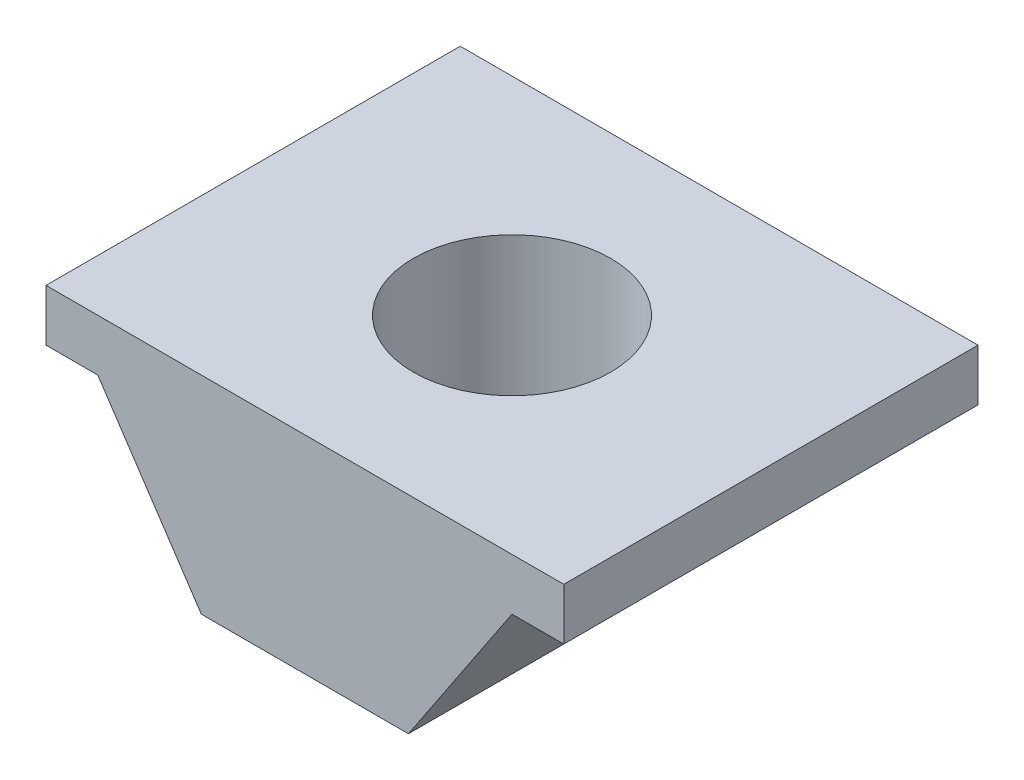
ISO-10303-21;
HEADER;
FILE_DESCRIPTION(('STEP AP214'),'2;1');
FILE_NAME('part.step','',(''),(''),'','','');
FILE_SCHEMA(('AUTOMOTIVE_DESIGN { 1 0 10303 214 1 1 1 1 }'));
ENDSEC;
DATA;
#1=APPLICATION_CONTEXT('core data for automotive mechanical design processes');
#2=APPLICATION_PROTOCOL_DEFINITION('international standard','automotive_design',2000,#1);
#3=PRODUCT_CONTEXT('',#1,'mechanical');
#4=PRODUCT('Part','Part','',(#3));
#5=PRODUCT_RELATED_PRODUCT_CATEGORY('part','',(#4));
#6=PRODUCT_DEFINITION_FORMATION('','',#4);
#7=PRODUCT_DEFINITION_CONTEXT('part definition',#1,'design');
#8=PRODUCT_DEFINITION('design','',#6,#7);
#9=PRODUCT_DEFINITION_SHAPE('','',#8);
#10=(LENGTH_UNIT() NAMED_UNIT(*) SI_UNIT(.MILLI.,.METRE.));
#11=(NAMED_UNIT(*) PLANE_ANGLE_UNIT() SI_UNIT($,.RADIAN.));
#12=(NAMED_UNIT(*) SI_UNIT($,.STERADIAN.) SOLID_ANGLE_UNIT());
#13=UNCERTAINTY_MEASURE_WITH_UNIT(LENGTH_MEASURE(1.E-05),#10,'distance_accuracy_value','');
#14=(GEOMETRIC_REPRESENTATION_CONTEXT(3) GLOBAL_UNCERTAINTY_ASSIGNED_CONTEXT((#13)) GLOBAL_UNIT_ASSIGNED_CONTEXT((#10,
#11,#12)) REPRESENTATION_CONTEXT('',''));
#15=CARTESIAN_POINT('',(0.,0.,0.));
#16=DIRECTION('',(0.,0.,1.));
#17=DIRECTION('',(1.,0.,0.));
#18=AXIS2_PLACEMENT_3D('',#15,#16,#17);
#19=CARTESIAN_POINT('',(0.,0.,20.));
#20=DIRECTION('',(1.,0.,0.));
#21=DIRECTION('',(0.,1.,0.));
#22=AXIS2_PLACEMENT_3D('',#19,#20,#21);
#23=PLANE('',#22);
#24=DIRECTION('',(0.,-1.,0.));
#25=VECTOR('',#24,1.);
#26=CARTESIAN_POINT('',(0.,0.,0.));
#27=LINE('',#26,#25);
#28=CARTESIAN_POINT('',(0.,0.,0.));
#29=VERTEX_POINT('',#28);
#30=CARTESIAN_POINT('',(0.,-2.5,0.));
#31=VERTEX_POINT('',#30);
#32=EDGE_CURVE('E130',#29,#31,#27,.T.);
#33=ORIENTED_EDGE('',*,*,#32,.T.);
#34=DIRECTION('',(0.,0.,-1.));
#35=VECTOR('',#34,1.);
#36=CARTESIAN_POINT('',(0.,-2.5,20.));
#37=LINE('',#36,#35);
#38=CARTESIAN_POINT('',(0.,-2.5,20.));
#39=VERTEX_POINT('',#38);
#40=EDGE_CURVE('E11',#39,#31,#37,.T.);
#41=ORIENTED_EDGE('',*,*,#40,.F.);
#42=DIRECTION('',(0.,-1.,0.));
#43=VECTOR('',#42,1.);
#44=CARTESIAN_POINT('',(0.,0.,20.));
#45=LINE('',#44,#43);
#46=CARTESIAN_POINT('',(0.,0.,20.));
#47=VERTEX_POINT('',#46);
#48=EDGE_CURVE('E145',#47,#39,#45,.T.);
#49=ORIENTED_EDGE('',*,*,#48,.F.);
#50=DIRECTION('',(0.,0.,-1.));
#51=VECTOR('',#50,1.);
#52=CARTESIAN_POINT('',(0.,0.,20.));
#53=LINE('',#52,#51);
#54=EDGE_CURVE('E126',#47,#29,#53,.T.);
#55=ORIENTED_EDGE('',*,*,#54,.T.);
#56=EDGE_LOOP('',(#33,#41,#49,#55));
#57=FACE_BOUND('',#56,.T.);
#58=ADVANCED_FACE('F34',(#57),#23,.F.);
#59=CARTESIAN_POINT('',(0.,-2.5,20.));
#60=DIRECTION('',(0.,1.,0.));
#61=DIRECTION('',(0.,0.,1.));
#62=AXIS2_PLACEMENT_3D('',#59,#60,#61);
#63=PLANE('',#62);
#64=DIRECTION('',(1.,0.,0.));
#65=VECTOR('',#64,1.);
#66=CARTESIAN_POINT('',(0.,-2.5,0.));
#67=LINE('',#66,#65);
#68=CARTESIAN_POINT('',(2.5,-2.5,0.));
#69=VERTEX_POINT('',#68);
#70=EDGE_CURVE('E133',#31,#69,#67,.T.);
#71=ORIENTED_EDGE('',*,*,#70,.T.);
#72=DIRECTION('',(0.,0.,-1.));
#73=VECTOR('',#72,1.);
#74=CARTESIAN_POINT('',(2.5,-2.5,20.));
#75=LINE('',#74,#73);
#76=CARTESIAN_POINT('',(2.5,-2.5,20.));
#77=VERTEX_POINT('',#76);
#78=EDGE_CURVE('E42',#77,#69,#75,.T.);
#79=ORIENTED_EDGE('',*,*,#78,.F.);
#80=DIRECTION('',(1.,0.,0.));
#81=VECTOR('',#80,1.);
#82=CARTESIAN_POINT('',(0.,-2.5,20.));
#83=LINE('',#82,#81);
#84=EDGE_CURVE('E93',#39,#77,#83,.T.);
#85=ORIENTED_EDGE('',*,*,#84,.F.);
#86=ORIENTED_EDGE('',*,*,#40,.T.);
#87=EDGE_LOOP('',(#71,#79,#85,#86));
#88=FACE_BOUND('',#87,.T.);
#89=ADVANCED_FACE('F202',(#88),#63,.F.);
#90=CARTESIAN_POINT('',(2.5,-2.5,20.));
#91=DIRECTION('',(0.832050294337844,0.554700196225229,0.));
#92=DIRECTION('',(-0.554700196225229,0.832050294337844,0.));
#93=AXIS2_PLACEMENT_3D('',#90,#91,#92);
#94=PLANE('',#93);
#95=DIRECTION('',(0.554700196225229,-0.832050294337844,0.));
#96=VECTOR('',#95,1.);
#97=CARTESIAN_POINT('',(2.5,-2.5,0.));
#98=LINE('',#97,#96);
#99=CARTESIAN_POINT('',(7.5,-10.,0.));
#100=VERTEX_POINT('',#99);
#101=EDGE_CURVE('E136',#69,#100,#98,.T.);
#102=ORIENTED_EDGE('',*,*,#101,.T.);
#103=DIRECTION('',(0.,0.,-1.));
#104=VECTOR('',#103,1.);
#105=CARTESIAN_POINT('',(7.5,-10.,20.));
#106=LINE('',#105,#104);
#107=CARTESIAN_POINT('',(7.5,-10.,20.));
#108=VERTEX_POINT('',#107);
#109=EDGE_CURVE('E152',#108,#100,#106,.T.);
#110=ORIENTED_EDGE('',*,*,#109,.F.);
#111=DIRECTION('',(0.554700196225229,-0.832050294337844,0.));
#112=VECTOR('',#111,1.);
#113=CARTESIAN_POINT('',(2.5,-2.5,20.));
#114=LINE('',#113,#112);
#115=EDGE_CURVE('E160',#77,#108,#114,.T.);
#116=ORIENTED_EDGE('',*,*,#115,.F.);
#117=ORIENTED_EDGE('',*,*,#78,.T.);
#118=EDGE_LOOP('',(#102,#110,#116,#117));
#119=FACE_BOUND('',#118,.T.);
#120=ADVANCED_FACE('F158',(#119),#94,.F.);
#121=CARTESIAN_POINT('',(7.5,-10.,20.));
#122=DIRECTION('',(0.,1.,0.));
#123=DIRECTION('',(0.,0.,1.));
#124=AXIS2_PLACEMENT_3D('',#121,#122,#123);
#125=PLANE('',#124);
#126=CARTESIAN_POINT('',(12.5,-10.,10.));
#127=DIRECTION('',(0.,1.,0.));
#128=DIRECTION('',(0.,0.,1.));
#129=AXIS2_PLACEMENT_3D('',#126,#127,#128);
#130=CIRCLE('',#129,4.7625);
#131=CARTESIAN_POINT('',(12.5,-10.,14.7625));
#132=VERTEX_POINT('',#131);
#133=EDGE_CURVE('E134',#132,#132,#130,.T.);
#134=ORIENTED_EDGE('',*,*,#133,.T.);
#135=EDGE_LOOP('',(#134));
#136=FACE_BOUND('',#135,.T.);
#137=DIRECTION('',(1.,0.,0.));
#138=VECTOR('',#137,1.);
#139=CARTESIAN_POINT('',(7.5,-10.,0.));
#140=LINE('',#139,#138);
#141=CARTESIAN_POINT('',(17.5,-10.,0.));
#142=VERTEX_POINT('',#141);
#143=EDGE_CURVE('E138',#100,#142,#140,.T.);
#144=ORIENTED_EDGE('',*,*,#143,.T.);
#145=DIRECTION('',(0.,0.,-1.));
#146=VECTOR('',#145,1.);
#147=CARTESIAN_POINT('',(17.5,-10.,20.));
#148=LINE('',#147,#146);
#149=CARTESIAN_POINT('',(17.5,-10.,20.));
#150=VERTEX_POINT('',#149);
#151=EDGE_CURVE('E149',#150,#142,#148,.T.);
#152=ORIENTED_EDGE('',*,*,#151,.F.);
#153=DIRECTION('',(1.,0.,0.));
#154=VECTOR('',#153,1.);
#155=CARTESIAN_POINT('',(7.5,-10.,20.));
#156=LINE('',#155,#154);
#157=EDGE_CURVE('E172',#108,#150,#156,.T.);
#158=ORIENTED_EDGE('',*,*,#157,.F.);
#159=ORIENTED_EDGE('',*,*,#109,.T.);
#160=EDGE_LOOP('',(#144,#152,#158,#159));
#161=FACE_BOUND('',#160,.T.);
#162=ADVANCED_FACE('F168',(#136,#161),#125,.F.);
#163=CARTESIAN_POINT('',(17.5,-10.,20.));
#164=DIRECTION('',(-0.832050294337844,0.554700196225229,0.));
#165=DIRECTION('',(-0.554700196225229,-0.832050294337844,0.));
#166=AXIS2_PLACEMENT_3D('',#163,#164,#165);
#167=PLANE('',#166);
#168=DIRECTION('',(0.554700196225229,0.832050294337844,0.));
#169=VECTOR('',#168,1.);
#170=CARTESIAN_POINT('',(17.5,-10.,0.));
#171=LINE('',#170,#169);
#172=CARTESIAN_POINT('',(22.5,-2.5,0.));
#173=VERTEX_POINT('',#172);
#174=EDGE_CURVE('E140',#142,#173,#171,.T.);
#175=ORIENTED_EDGE('',*,*,#174,.T.);
#176=DIRECTION('',(0.,0.,-1.));
#177=VECTOR('',#176,1.);
#178=CARTESIAN_POINT('',(22.5,-2.5,20.));
#179=LINE('',#178,#177);
#180=CARTESIAN_POINT('',(22.5,-2.5,20.));
#181=VERTEX_POINT('',#180);
#182=EDGE_CURVE('E121',#181,#173,#179,.T.);
#183=ORIENTED_EDGE('',*,*,#182,.F.);
#184=DIRECTION('',(0.554700196225229,0.832050294337844,0.));
#185=VECTOR('',#184,1.);
#186=CARTESIAN_POINT('',(17.5,-10.,20.));
#187=LINE('',#186,#185);
#188=EDGE_CURVE('E112',#150,#181,#187,.T.);
#189=ORIENTED_EDGE('',*,*,#188,.F.);
#190=ORIENTED_EDGE('',*,*,#151,.T.);
#191=EDGE_LOOP('',(#175,#183,#189,#190));
#192=FACE_BOUND('',#191,.T.);
#193=ADVANCED_FACE('F171',(#192),#167,.F.);
#194=CARTESIAN_POINT('',(25.,-2.5,20.));
#195=DIRECTION('',(0.,1.,0.));
#196=DIRECTION('',(-1.,0.,0.));
#197=AXIS2_PLACEMENT_3D('',#194,#195,#196);
#198=PLANE('',#197);
#199=DIRECTION('',(1.,0.,0.));
#200=VECTOR('',#199,1.);
#201=CARTESIAN_POINT('',(25.,-2.5,0.));
#202=LINE('',#201,#200);
#203=CARTESIAN_POINT('',(25.,-2.5,0.));
#204=VERTEX_POINT('',#203);
#205=EDGE_CURVE('E120',#173,#204,#202,.T.);
#206=ORIENTED_EDGE('',*,*,#205,.T.);
#207=DIRECTION('',(0.,0.,-1.));
#208=VECTOR('',#207,1.);
#209=CARTESIAN_POINT('',(25.,-2.5,20.));
#210=LINE('',#209,#208);
#211=CARTESIAN_POINT('',(25.,-2.5,20.));
#212=VERTEX_POINT('',#211);
#213=EDGE_CURVE('E117',#212,#204,#210,.T.);
#214=ORIENTED_EDGE('',*,*,#213,.F.);
#215=DIRECTION('',(1.,0.,0.));
#216=VECTOR('',#215,1.);
#217=CARTESIAN_POINT('',(25.,-2.5,20.));
#218=LINE('',#217,#216);
#219=EDGE_CURVE('E106',#181,#212,#218,.T.);
#220=ORIENTED_EDGE('',*,*,#219,.F.);
#221=ORIENTED_EDGE('',*,*,#182,.T.);
#222=EDGE_LOOP('',(#206,#214,#220,#221));
#223=FACE_BOUND('',#222,.T.);
#224=ADVANCED_FACE('F118',(#223),#198,.F.);
#225=CARTESIAN_POINT('',(25.,0.,20.));
#226=DIRECTION('',(-1.,0.,0.));
#227=DIRECTION('',(0.,0.,1.));
#228=AXIS2_PLACEMENT_3D('',#225,#226,#227);
#229=PLANE('',#228);
#230=DIRECTION('',(0.,1.,0.));
#231=VECTOR('',#230,1.);
#232=CARTESIAN_POINT('',(25.,0.,0.));
#233=LINE('',#232,#231);
#234=CARTESIAN_POINT('',(25.,0.,0.));
#235=VERTEX_POINT('',#234);
#236=EDGE_CURVE('E79',#204,#235,#233,.T.);
#237=ORIENTED_EDGE('',*,*,#236,.T.);
#238=DIRECTION('',(0.,0.,-1.));
#239=VECTOR('',#238,1.);
#240=CARTESIAN_POINT('',(25.,0.,20.));
#241=LINE('',#240,#239);
#242=CARTESIAN_POINT('',(25.,0.,20.));
#243=VERTEX_POINT('',#242);
#244=EDGE_CURVE('E122',#243,#235,#241,.T.);
#245=ORIENTED_EDGE('',*,*,#244,.F.);
#246=DIRECTION('',(0.,1.,0.));
#247=VECTOR('',#246,1.);
#248=CARTESIAN_POINT('',(25.,0.,20.));
#249=LINE('',#248,#247);
#250=EDGE_CURVE('E110',#212,#243,#249,.T.);
#251=ORIENTED_EDGE('',*,*,#250,.F.);
#252=ORIENTED_EDGE('',*,*,#213,.T.);
#253=EDGE_LOOP('',(#237,#245,#251,#252));
#254=FACE_BOUND('',#253,.T.);
#255=ADVANCED_FACE('F124',(#254),#229,.F.);
#256=CARTESIAN_POINT('',(0.,0.,20.));
#257=DIRECTION('',(0.,-1.,0.));
#258=DIRECTION('',(0.,0.,-1.));
#259=AXIS2_PLACEMENT_3D('',#256,#257,#258);
#260=PLANE('',#259);
#261=CARTESIAN_POINT('',(12.5,0.,10.));
#262=DIRECTION('',(0.,1.,0.));
#263=DIRECTION('',(0.,0.,1.));
#264=AXIS2_PLACEMENT_3D('',#261,#262,#263);
#265=CIRCLE('',#264,4.7625);
#266=CARTESIAN_POINT('',(12.5,0.,14.7625));
#267=VERTEX_POINT('',#266);
#268=EDGE_CURVE('E178',#267,#267,#265,.T.);
#269=ORIENTED_EDGE('',*,*,#268,.F.);
#270=EDGE_LOOP('',(#269));
#271=FACE_BOUND('',#270,.T.);
#272=DIRECTION('',(-1.,0.,0.));
#273=VECTOR('',#272,1.);
#274=CARTESIAN_POINT('',(0.,0.,0.));
#275=LINE('',#274,#273);
#276=EDGE_CURVE('E85',#235,#29,#275,.T.);
#277=ORIENTED_EDGE('',*,*,#276,.T.);
#278=ORIENTED_EDGE('',*,*,#54,.F.);
#279=DIRECTION('',(-1.,0.,0.));
#280=VECTOR('',#279,1.);
#281=CARTESIAN_POINT('',(0.,0.,20.));
#282=LINE('',#281,#280);
#283=EDGE_CURVE('E50',#243,#47,#282,.T.);
#284=ORIENTED_EDGE('',*,*,#283,.F.);
#285=ORIENTED_EDGE('',*,*,#244,.T.);
#286=EDGE_LOOP('',(#277,#278,#284,#285));
#287=FACE_BOUND('',#286,.T.);
#288=ADVANCED_FACE('F191',(#271,#287),#260,.F.);
#289=CARTESIAN_POINT('',(0.,0.,20.));
#290=DIRECTION('',(0.,0.,1.));
#291=DIRECTION('',(1.,0.,0.));
#292=AXIS2_PLACEMENT_3D('',#289,#290,#291);
#293=PLANE('',#292);
#294=ORIENTED_EDGE('',*,*,#48,.T.);
#295=ORIENTED_EDGE('',*,*,#84,.T.);
#296=ORIENTED_EDGE('',*,*,#115,.T.);
#297=ORIENTED_EDGE('',*,*,#157,.T.);
#298=ORIENTED_EDGE('',*,*,#188,.T.);
#299=ORIENTED_EDGE('',*,*,#219,.T.);
#300=ORIENTED_EDGE('',*,*,#250,.T.);
#301=ORIENTED_EDGE('',*,*,#283,.T.);
#302=EDGE_LOOP('',(#294,#295,#296,#297,#298,#299,#300,#301));
#303=FACE_BOUND('',#302,.T.);
#304=ADVANCED_FACE('F108',(#303),#293,.T.);
#305=CARTESIAN_POINT('',(0.,0.,0.));
#306=DIRECTION('',(0.,0.,1.));
#307=DIRECTION('',(1.,0.,0.));
#308=AXIS2_PLACEMENT_3D('',#305,#306,#307);
#309=PLANE('',#308);
#310=ORIENTED_EDGE('',*,*,#32,.F.);
#311=ORIENTED_EDGE('',*,*,#276,.F.);
#312=ORIENTED_EDGE('',*,*,#236,.F.);
#313=ORIENTED_EDGE('',*,*,#205,.F.);
#314=ORIENTED_EDGE('',*,*,#174,.F.);
#315=ORIENTED_EDGE('',*,*,#143,.F.);
#316=ORIENTED_EDGE('',*,*,#101,.F.);
#317=ORIENTED_EDGE('',*,*,#70,.F.);
#318=EDGE_LOOP('',(#310,#311,#312,#313,#314,#315,#316,#317));
#319=FACE_BOUND('',#318,.T.);
#320=ADVANCED_FACE('F164',(#319),#309,.F.);
#321=CARTESIAN_POINT('',(12.5,-10.,10.));
#322=DIRECTION('',(0.,1.,0.));
#323=DIRECTION('',(0.,0.,1.));
#324=AXIS2_PLACEMENT_3D('',#321,#322,#323);
#325=CYLINDRICAL_SURFACE('',#324,4.7625);
#326=ORIENTED_EDGE('',*,*,#133,.F.);
#327=EDGE_LOOP('',(#326));
#328=FACE_BOUND('',#327,.T.);
#329=ORIENTED_EDGE('',*,*,#268,.T.);
#330=EDGE_LOOP('',(#329));
#331=FACE_BOUND('',#330,.T.);
#332=ADVANCED_FACE('F185',(#328,#331),#325,.F.);
#333=CLOSED_SHELL('',(#58,#89,#120,#162,#193,#224,#255,#288,#304,#320,#332));
#334=MANIFOLD_SOLID_BREP('B2',#333);
#335=ADVANCED_BREP_SHAPE_REPRESENTATION('',(#18,#334),#14);
#336=SHAPE_DEFINITION_REPRESENTATION(#9,#335);
ENDSEC;
END-ISO-10303-21;
